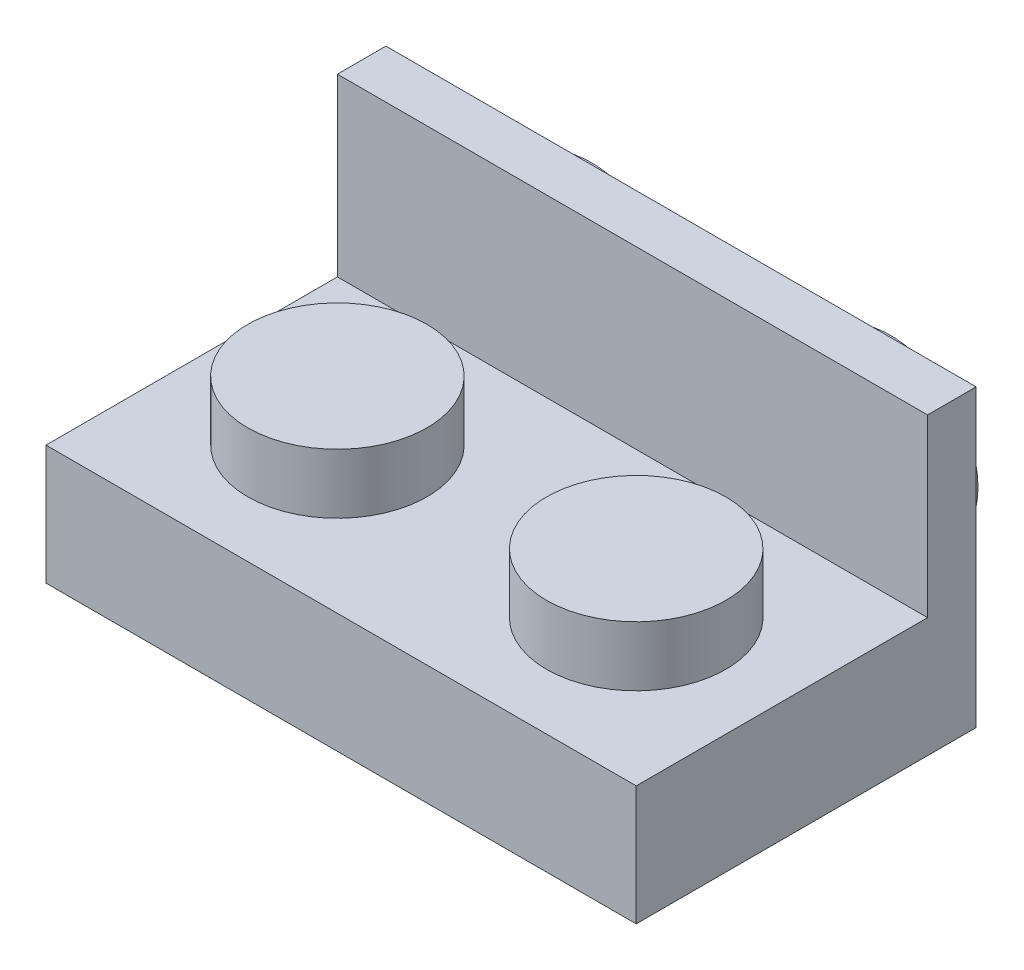
ISO-10303-21;
HEADER;
FILE_DESCRIPTION(('STEP AP214'),'2;1');
FILE_NAME('part.step','',(''),(''),'','','');
FILE_SCHEMA(('AUTOMOTIVE_DESIGN { 1 0 10303 214 1 1 1 1 }'));
ENDSEC;
DATA;
#1=APPLICATION_CONTEXT('core data for automotive mechanical design processes');
#2=APPLICATION_PROTOCOL_DEFINITION('international standard','automotive_design',2000,#1);
#3=PRODUCT_CONTEXT('',#1,'mechanical');
#4=PRODUCT('Part','Part','',(#3));
#5=PRODUCT_RELATED_PRODUCT_CATEGORY('part','',(#4));
#6=PRODUCT_DEFINITION_FORMATION('','',#4);
#7=PRODUCT_DEFINITION_CONTEXT('part definition',#1,'design');
#8=PRODUCT_DEFINITION('design','',#6,#7);
#9=PRODUCT_DEFINITION_SHAPE('','',#8);
#10=(LENGTH_UNIT() NAMED_UNIT(*) SI_UNIT(.MILLI.,.METRE.));
#11=(NAMED_UNIT(*) PLANE_ANGLE_UNIT() SI_UNIT($,.RADIAN.));
#12=(NAMED_UNIT(*) SI_UNIT($,.STERADIAN.) SOLID_ANGLE_UNIT());
#13=UNCERTAINTY_MEASURE_WITH_UNIT(LENGTH_MEASURE(1.E-05),#10,'distance_accuracy_value','');
#14=(GEOMETRIC_REPRESENTATION_CONTEXT(3) GLOBAL_UNCERTAINTY_ASSIGNED_CONTEXT((#13)) GLOBAL_UNIT_ASSIGNED_CONTEXT((#10,
#11,#12)) REPRESENTATION_CONTEXT('',''));
#15=CARTESIAN_POINT('',(0.,0.,0.));
#16=DIRECTION('',(0.,0.,1.));
#17=DIRECTION('',(1.,0.,0.));
#18=AXIS2_PLACEMENT_3D('',#15,#16,#17);
#19=CARTESIAN_POINT('',(0.,0.,-7.8));
#20=DIRECTION('',(0.,-1.,0.));
#21=DIRECTION('',(0.,0.,-1.));
#22=AXIS2_PLACEMENT_3D('',#19,#20,#21);
#23=PLANE('',#22);
#24=DIRECTION('',(1.,0.,0.));
#25=VECTOR('',#24,1.);
#26=CARTESIAN_POINT('',(0.,0.,0.));
#27=LINE('',#26,#25);
#28=CARTESIAN_POINT('',(0.,0.,0.));
#29=VERTEX_POINT('',#28);
#30=CARTESIAN_POINT('',(15.8,0.,0.));
#31=VERTEX_POINT('',#30);
#32=EDGE_CURVE('E107',#29,#31,#27,.T.);
#33=ORIENTED_EDGE('',*,*,#32,.F.);
#34=DIRECTION('',(0.,0.,1.));
#35=VECTOR('',#34,1.);
#36=CARTESIAN_POINT('',(0.,0.,-7.8));
#37=LINE('',#36,#35);
#38=CARTESIAN_POINT('',(0.,0.,-9.1));
#39=VERTEX_POINT('',#38);
#40=EDGE_CURVE('E113',#39,#29,#37,.T.);
#41=ORIENTED_EDGE('',*,*,#40,.F.);
#42=DIRECTION('',(-1.,0.,0.));
#43=VECTOR('',#42,1.);
#44=CARTESIAN_POINT('',(0.,0.,-9.1));
#45=LINE('',#44,#43);
#46=CARTESIAN_POINT('',(15.8,0.,-9.1));
#47=VERTEX_POINT('',#46);
#48=EDGE_CURVE('E141',#47,#39,#45,.T.);
#49=ORIENTED_EDGE('',*,*,#48,.F.);
#50=DIRECTION('',(0.,0.,1.));
#51=VECTOR('',#50,1.);
#52=CARTESIAN_POINT('',(15.8,0.,-7.8));
#53=LINE('',#52,#51);
#54=EDGE_CURVE('E99',#47,#31,#53,.T.);
#55=ORIENTED_EDGE('',*,*,#54,.T.);
#56=EDGE_LOOP('',(#33,#41,#49,#55));
#57=FACE_BOUND('',#56,.T.);
#58=DIRECTION('',(0.,0.,1.));
#59=VECTOR('',#58,1.);
#60=CARTESIAN_POINT('',(1.2,0.,-7.8));
#61=LINE('',#60,#59);
#62=CARTESIAN_POINT('',(1.2,0.,-6.6));
#63=VERTEX_POINT('',#62);
#64=CARTESIAN_POINT('',(1.2,0.,-1.2));
#65=VERTEX_POINT('',#64);
#66=EDGE_CURVE('E211',#63,#65,#61,.T.);
#67=ORIENTED_EDGE('',*,*,#66,.T.);
#68=DIRECTION('',(1.,0.,0.));
#69=VECTOR('',#68,1.);
#70=CARTESIAN_POINT('',(0.,0.,-1.2));
#71=LINE('',#70,#69);
#72=CARTESIAN_POINT('',(14.6,0.,-1.2));
#73=VERTEX_POINT('',#72);
#74=EDGE_CURVE('E186',#65,#73,#71,.T.);
#75=ORIENTED_EDGE('',*,*,#74,.T.);
#76=DIRECTION('',(0.,0.,1.));
#77=VECTOR('',#76,1.);
#78=CARTESIAN_POINT('',(14.6,0.,-7.8));
#79=LINE('',#78,#77);
#80=CARTESIAN_POINT('',(14.6,0.,-6.6));
#81=VERTEX_POINT('',#80);
#82=EDGE_CURVE('E207',#81,#73,#79,.T.);
#83=ORIENTED_EDGE('',*,*,#82,.F.);
#84=DIRECTION('',(1.,0.,0.));
#85=VECTOR('',#84,1.);
#86=CARTESIAN_POINT('',(0.,0.,-6.6));
#87=LINE('',#86,#85);
#88=EDGE_CURVE('E56',#63,#81,#87,.T.);
#89=ORIENTED_EDGE('',*,*,#88,.F.);
#90=EDGE_LOOP('',(#67,#75,#83,#89));
#91=FACE_BOUND('',#90,.T.);
#92=ADVANCED_FACE('F41',(#57,#91),#23,.T.);
#93=CARTESIAN_POINT('',(0.,0.,-7.8));
#94=DIRECTION('',(-1.,0.,0.));
#95=DIRECTION('',(0.,0.,1.));
#96=AXIS2_PLACEMENT_3D('',#93,#94,#95);
#97=PLANE('',#96);
#98=DIRECTION('',(0.,-1.,0.));
#99=VECTOR('',#98,1.);
#100=CARTESIAN_POINT('',(0.,0.,0.));
#101=LINE('',#100,#99);
#102=CARTESIAN_POINT('',(0.,3.2,0.));
#103=VERTEX_POINT('',#102);
#104=EDGE_CURVE('E236',#103,#29,#101,.T.);
#105=ORIENTED_EDGE('',*,*,#104,.F.);
#106=DIRECTION('',(0.,0.,1.));
#107=VECTOR('',#106,1.);
#108=CARTESIAN_POINT('',(0.,3.2,-7.8));
#109=LINE('',#108,#107);
#110=CARTESIAN_POINT('',(0.,3.2,-7.8));
#111=VERTEX_POINT('',#110);
#112=EDGE_CURVE('E98',#111,#103,#109,.T.);
#113=ORIENTED_EDGE('',*,*,#112,.F.);
#114=DIRECTION('',(0.,1.,0.));
#115=VECTOR('',#114,1.);
#116=CARTESIAN_POINT('',(0.,7.9,-7.8));
#117=LINE('',#116,#115);
#118=CARTESIAN_POINT('',(0.,7.9,-7.8));
#119=VERTEX_POINT('',#118);
#120=EDGE_CURVE('E65',#111,#119,#117,.T.);
#121=ORIENTED_EDGE('',*,*,#120,.T.);
#122=DIRECTION('',(0.,0.,1.));
#123=VECTOR('',#122,1.);
#124=CARTESIAN_POINT('',(0.,7.9,-9.1));
#125=LINE('',#124,#123);
#126=CARTESIAN_POINT('',(0.,7.9,-9.1));
#127=VERTEX_POINT('',#126);
#128=EDGE_CURVE('E170',#127,#119,#125,.T.);
#129=ORIENTED_EDGE('',*,*,#128,.F.);
#130=DIRECTION('',(0.,1.,0.));
#131=VECTOR('',#130,1.);
#132=CARTESIAN_POINT('',(0.,7.9,-9.1));
#133=LINE('',#132,#131);
#134=EDGE_CURVE('E145',#39,#127,#133,.T.);
#135=ORIENTED_EDGE('',*,*,#134,.F.);
#136=ORIENTED_EDGE('',*,*,#40,.T.);
#137=EDGE_LOOP('',(#105,#113,#121,#129,#135,#136));
#138=FACE_BOUND('',#137,.T.);
#139=ADVANCED_FACE('F43',(#138),#97,.T.);
#140=CARTESIAN_POINT('',(0.,3.2,-7.8));
#141=DIRECTION('',(0.,1.,0.));
#142=DIRECTION('',(0.,0.,1.));
#143=AXIS2_PLACEMENT_3D('',#140,#141,#142);
#144=PLANE('',#143);
#145=CARTESIAN_POINT('',(11.9,3.2,-3.9));
#146=DIRECTION('',(0.,1.,0.));
#147=DIRECTION('',(0.,0.,1.));
#148=AXIS2_PLACEMENT_3D('',#145,#146,#147);
#149=CIRCLE('',#148,2.4);
#150=CARTESIAN_POINT('',(11.9,3.2,-1.5));
#151=VERTEX_POINT('',#150);
#152=EDGE_CURVE('E191',#151,#151,#149,.T.);
#153=ORIENTED_EDGE('',*,*,#152,.F.);
#154=EDGE_LOOP('',(#153));
#155=FACE_BOUND('',#154,.T.);
#156=CARTESIAN_POINT('',(3.9,3.2,-3.9));
#157=DIRECTION('',(0.,1.,0.));
#158=DIRECTION('',(0.,0.,1.));
#159=AXIS2_PLACEMENT_3D('',#156,#157,#158);
#160=CIRCLE('',#159,2.4);
#161=CARTESIAN_POINT('',(3.9,3.2,-1.5));
#162=VERTEX_POINT('',#161);
#163=EDGE_CURVE('E232',#162,#162,#160,.T.);
#164=ORIENTED_EDGE('',*,*,#163,.F.);
#165=EDGE_LOOP('',(#164));
#166=FACE_BOUND('',#165,.T.);
#167=DIRECTION('',(-1.,0.,0.));
#168=VECTOR('',#167,1.);
#169=CARTESIAN_POINT('',(0.,3.2,0.));
#170=LINE('',#169,#168);
#171=CARTESIAN_POINT('',(15.8,3.2,0.));
#172=VERTEX_POINT('',#171);
#173=EDGE_CURVE('E105',#172,#103,#170,.T.);
#174=ORIENTED_EDGE('',*,*,#173,.F.);
#175=DIRECTION('',(0.,0.,1.));
#176=VECTOR('',#175,1.);
#177=CARTESIAN_POINT('',(15.8,3.2,-7.8));
#178=LINE('',#177,#176);
#179=CARTESIAN_POINT('',(15.8,3.2,-7.8));
#180=VERTEX_POINT('',#179);
#181=EDGE_CURVE('E85',#180,#172,#178,.T.);
#182=ORIENTED_EDGE('',*,*,#181,.F.);
#183=DIRECTION('',(-1.,0.,0.));
#184=VECTOR('',#183,1.);
#185=CARTESIAN_POINT('',(0.,3.2,-7.8));
#186=LINE('',#185,#184);
#187=EDGE_CURVE('E111',#180,#111,#186,.T.);
#188=ORIENTED_EDGE('',*,*,#187,.T.);
#189=ORIENTED_EDGE('',*,*,#112,.T.);
#190=EDGE_LOOP('',(#174,#182,#188,#189));
#191=FACE_BOUND('',#190,.T.);
#192=ADVANCED_FACE('F109',(#155,#166,#191),#144,.T.);
#193=CARTESIAN_POINT('',(15.8,0.,-7.8));
#194=DIRECTION('',(1.,0.,0.));
#195=DIRECTION('',(0.,0.,-1.));
#196=AXIS2_PLACEMENT_3D('',#193,#194,#195);
#197=PLANE('',#196);
#198=DIRECTION('',(0.,1.,0.));
#199=VECTOR('',#198,1.);
#200=CARTESIAN_POINT('',(15.8,0.,0.));
#201=LINE('',#200,#199);
#202=EDGE_CURVE('E89',#31,#172,#201,.T.);
#203=ORIENTED_EDGE('',*,*,#202,.F.);
#204=ORIENTED_EDGE('',*,*,#54,.F.);
#205=DIRECTION('',(0.,-1.,0.));
#206=VECTOR('',#205,1.);
#207=CARTESIAN_POINT('',(15.8,0.,-9.1));
#208=LINE('',#207,#206);
#209=CARTESIAN_POINT('',(15.8,7.9,-9.1));
#210=VERTEX_POINT('',#209);
#211=EDGE_CURVE('E149',#210,#47,#208,.T.);
#212=ORIENTED_EDGE('',*,*,#211,.F.);
#213=DIRECTION('',(0.,0.,1.));
#214=VECTOR('',#213,1.);
#215=CARTESIAN_POINT('',(15.8,7.9,-9.1));
#216=LINE('',#215,#214);
#217=CARTESIAN_POINT('',(15.8,7.9,-7.8));
#218=VERTEX_POINT('',#217);
#219=EDGE_CURVE('E165',#210,#218,#216,.T.);
#220=ORIENTED_EDGE('',*,*,#219,.T.);
#221=DIRECTION('',(0.,-1.,0.));
#222=VECTOR('',#221,1.);
#223=CARTESIAN_POINT('',(15.8,0.,-7.8));
#224=LINE('',#223,#222);
#225=EDGE_CURVE('E94',#218,#180,#224,.T.);
#226=ORIENTED_EDGE('',*,*,#225,.T.);
#227=ORIENTED_EDGE('',*,*,#181,.T.);
#228=EDGE_LOOP('',(#203,#204,#212,#220,#226,#227));
#229=FACE_BOUND('',#228,.T.);
#230=ADVANCED_FACE('F87',(#229),#197,.T.);
#231=CARTESIAN_POINT('',(0.,0.,0.));
#232=DIRECTION('',(0.,0.,-1.));
#233=DIRECTION('',(-1.,0.,0.));
#234=AXIS2_PLACEMENT_3D('',#231,#232,#233);
#235=PLANE('',#234);
#236=ORIENTED_EDGE('',*,*,#104,.T.);
#237=ORIENTED_EDGE('',*,*,#32,.T.);
#238=ORIENTED_EDGE('',*,*,#202,.T.);
#239=ORIENTED_EDGE('',*,*,#173,.T.);
#240=EDGE_LOOP('',(#236,#237,#238,#239));
#241=FACE_BOUND('',#240,.T.);
#242=ADVANCED_FACE('F104',(#241),#235,.F.);
#243=CARTESIAN_POINT('',(3.9,4.8,-3.9));
#244=DIRECTION('',(0.,-1.,0.));
#245=DIRECTION('',(0.,0.,-1.));
#246=AXIS2_PLACEMENT_3D('',#243,#244,#245);
#247=CYLINDRICAL_SURFACE('',#246,2.4);
#248=CARTESIAN_POINT('',(3.9,4.8,-3.9));
#249=DIRECTION('',(0.,1.,0.));
#250=DIRECTION('',(0.,0.,1.));
#251=AXIS2_PLACEMENT_3D('',#248,#249,#250);
#252=CIRCLE('',#251,2.4);
#253=CARTESIAN_POINT('',(3.9,4.8,-1.5));
#254=VERTEX_POINT('',#253);
#255=EDGE_CURVE('E233',#254,#254,#252,.T.);
#256=ORIENTED_EDGE('',*,*,#255,.F.);
#257=EDGE_LOOP('',(#256));
#258=FACE_BOUND('',#257,.T.);
#259=ORIENTED_EDGE('',*,*,#163,.T.);
#260=EDGE_LOOP('',(#259));
#261=FACE_BOUND('',#260,.T.);
#262=ADVANCED_FACE('F286',(#258,#261),#247,.T.);
#263=CARTESIAN_POINT('',(3.9,4.8,-3.9));
#264=DIRECTION('',(0.,1.,0.));
#265=DIRECTION('',(0.,0.,1.));
#266=AXIS2_PLACEMENT_3D('',#263,#264,#265);
#267=PLANE('',#266);
#268=ORIENTED_EDGE('',*,*,#255,.T.);
#269=EDGE_LOOP('',(#268));
#270=FACE_BOUND('',#269,.T.);
#271=ADVANCED_FACE('F289',(#270),#267,.T.);
#272=CARTESIAN_POINT('',(11.9,4.8,-3.9));
#273=DIRECTION('',(0.,-1.,0.));
#274=DIRECTION('',(0.,0.,-1.));
#275=AXIS2_PLACEMENT_3D('',#272,#273,#274);
#276=CYLINDRICAL_SURFACE('',#275,2.4);
#277=CARTESIAN_POINT('',(11.9,4.8,-3.9));
#278=DIRECTION('',(0.,1.,0.));
#279=DIRECTION('',(0.,0.,1.));
#280=AXIS2_PLACEMENT_3D('',#277,#278,#279);
#281=CIRCLE('',#280,2.4);
#282=CARTESIAN_POINT('',(11.9,4.8,-1.5));
#283=VERTEX_POINT('',#282);
#284=EDGE_CURVE('E229',#283,#283,#281,.T.);
#285=ORIENTED_EDGE('',*,*,#284,.F.);
#286=EDGE_LOOP('',(#285));
#287=FACE_BOUND('',#286,.T.);
#288=ORIENTED_EDGE('',*,*,#152,.T.);
#289=EDGE_LOOP('',(#288));
#290=FACE_BOUND('',#289,.T.);
#291=ADVANCED_FACE('F293',(#287,#290),#276,.T.);
#292=CARTESIAN_POINT('',(11.9,4.8,-3.9));
#293=DIRECTION('',(0.,1.,0.));
#294=DIRECTION('',(0.,0.,1.));
#295=AXIS2_PLACEMENT_3D('',#292,#293,#294);
#296=PLANE('',#295);
#297=ORIENTED_EDGE('',*,*,#284,.T.);
#298=EDGE_LOOP('',(#297));
#299=FACE_BOUND('',#298,.T.);
#300=ADVANCED_FACE('F297',(#299),#296,.T.);
#301=CARTESIAN_POINT('',(1.2,0.,-7.8));
#302=DIRECTION('',(-1.,0.,0.));
#303=DIRECTION('',(0.,0.,1.));
#304=AXIS2_PLACEMENT_3D('',#301,#302,#303);
#305=PLANE('',#304);
#306=DIRECTION('',(0.,-1.,0.));
#307=VECTOR('',#306,1.);
#308=CARTESIAN_POINT('',(1.2,0.,-1.2));
#309=LINE('',#308,#307);
#310=CARTESIAN_POINT('',(1.2,2.,-1.2));
#311=VERTEX_POINT('',#310);
#312=EDGE_CURVE('E183',#311,#65,#309,.T.);
#313=ORIENTED_EDGE('',*,*,#312,.T.);
#314=ORIENTED_EDGE('',*,*,#66,.F.);
#315=DIRECTION('',(0.,-1.,0.));
#316=VECTOR('',#315,1.);
#317=CARTESIAN_POINT('',(1.2,0.,-6.6));
#318=LINE('',#317,#316);
#319=CARTESIAN_POINT('',(1.2,2.,-6.6));
#320=VERTEX_POINT('',#319);
#321=EDGE_CURVE('E193',#320,#63,#318,.T.);
#322=ORIENTED_EDGE('',*,*,#321,.F.);
#323=DIRECTION('',(0.,0.,1.));
#324=VECTOR('',#323,1.);
#325=CARTESIAN_POINT('',(1.2,2.,-7.8));
#326=LINE('',#325,#324);
#327=EDGE_CURVE('E188',#320,#311,#326,.T.);
#328=ORIENTED_EDGE('',*,*,#327,.T.);
#329=EDGE_LOOP('',(#313,#314,#322,#328));
#330=FACE_BOUND('',#329,.T.);
#331=ADVANCED_FACE('F271',(#330),#305,.F.);
#332=CARTESIAN_POINT('',(0.,2.,-7.8));
#333=DIRECTION('',(0.,1.,0.));
#334=DIRECTION('',(0.,0.,1.));
#335=AXIS2_PLACEMENT_3D('',#332,#333,#334);
#336=PLANE('',#335);
#337=CARTESIAN_POINT('',(7.9,2.,-3.9));
#338=DIRECTION('',(0.,1.,0.));
#339=DIRECTION('',(0.,0.,1.));
#340=AXIS2_PLACEMENT_3D('',#337,#338,#339);
#341=CIRCLE('',#340,1.5);
#342=CARTESIAN_POINT('',(7.9,2.,-2.4));
#343=VERTEX_POINT('',#342);
#344=EDGE_CURVE('E117',#343,#343,#341,.F.);
#345=ORIENTED_EDGE('',*,*,#344,.F.);
#346=EDGE_LOOP('',(#345));
#347=FACE_BOUND('',#346,.T.);
#348=CARTESIAN_POINT('',(11.9,2.,-3.9));
#349=DIRECTION('',(0.,1.,0.));
#350=DIRECTION('',(0.,0.,1.));
#351=AXIS2_PLACEMENT_3D('',#348,#349,#350);
#352=CIRCLE('',#351,1.2);
#353=CARTESIAN_POINT('',(11.9,2.,-2.7));
#354=VERTEX_POINT('',#353);
#355=EDGE_CURVE('E177',#354,#354,#352,.T.);
#356=ORIENTED_EDGE('',*,*,#355,.T.);
#357=EDGE_LOOP('',(#356));
#358=FACE_BOUND('',#357,.T.);
#359=CARTESIAN_POINT('',(3.9,2.,-3.9));
#360=DIRECTION('',(0.,1.,0.));
#361=DIRECTION('',(0.,0.,1.));
#362=AXIS2_PLACEMENT_3D('',#359,#360,#361);
#363=CIRCLE('',#362,1.2);
#364=CARTESIAN_POINT('',(3.9,2.,-2.7));
#365=VERTEX_POINT('',#364);
#366=EDGE_CURVE('E199',#365,#365,#363,.T.);
#367=ORIENTED_EDGE('',*,*,#366,.T.);
#368=EDGE_LOOP('',(#367));
#369=FACE_BOUND('',#368,.T.);
#370=DIRECTION('',(-1.,0.,0.));
#371=VECTOR('',#370,1.);
#372=CARTESIAN_POINT('',(0.,2.,-1.2));
#373=LINE('',#372,#371);
#374=CARTESIAN_POINT('',(14.6,2.,-1.2));
#375=VERTEX_POINT('',#374);
#376=EDGE_CURVE('E195',#375,#311,#373,.T.);
#377=ORIENTED_EDGE('',*,*,#376,.T.);
#378=ORIENTED_EDGE('',*,*,#327,.F.);
#379=DIRECTION('',(-1.,0.,0.));
#380=VECTOR('',#379,1.);
#381=CARTESIAN_POINT('',(0.,2.,-6.6));
#382=LINE('',#381,#380);
#383=CARTESIAN_POINT('',(14.6,2.,-6.6));
#384=VERTEX_POINT('',#383);
#385=EDGE_CURVE('E208',#384,#320,#382,.T.);
#386=ORIENTED_EDGE('',*,*,#385,.F.);
#387=DIRECTION('',(0.,0.,1.));
#388=VECTOR('',#387,1.);
#389=CARTESIAN_POINT('',(14.6,2.,-7.8));
#390=LINE('',#389,#388);
#391=EDGE_CURVE('E192',#384,#375,#390,.T.);
#392=ORIENTED_EDGE('',*,*,#391,.T.);
#393=EDGE_LOOP('',(#377,#378,#386,#392));
#394=FACE_BOUND('',#393,.T.);
#395=ADVANCED_FACE('F327',(#347,#358,#369,#394),#336,.F.);
#396=CARTESIAN_POINT('',(14.6,0.,-7.8));
#397=DIRECTION('',(1.,0.,0.));
#398=DIRECTION('',(0.,0.,-1.));
#399=AXIS2_PLACEMENT_3D('',#396,#397,#398);
#400=PLANE('',#399);
#401=DIRECTION('',(0.,1.,0.));
#402=VECTOR('',#401,1.);
#403=CARTESIAN_POINT('',(14.6,0.,-1.2));
#404=LINE('',#403,#402);
#405=EDGE_CURVE('E204',#73,#375,#404,.T.);
#406=ORIENTED_EDGE('',*,*,#405,.T.);
#407=ORIENTED_EDGE('',*,*,#391,.F.);
#408=DIRECTION('',(0.,1.,0.));
#409=VECTOR('',#408,1.);
#410=CARTESIAN_POINT('',(14.6,0.,-6.6));
#411=LINE('',#410,#409);
#412=EDGE_CURVE('E212',#81,#384,#411,.T.);
#413=ORIENTED_EDGE('',*,*,#412,.F.);
#414=ORIENTED_EDGE('',*,*,#82,.T.);
#415=EDGE_LOOP('',(#406,#407,#413,#414));
#416=FACE_BOUND('',#415,.T.);
#417=ADVANCED_FACE('F324',(#416),#400,.F.);
#418=CARTESIAN_POINT('',(0.,0.,-6.6));
#419=DIRECTION('',(0.,0.,-1.));
#420=DIRECTION('',(-1.,0.,0.));
#421=AXIS2_PLACEMENT_3D('',#418,#419,#420);
#422=PLANE('',#421);
#423=ORIENTED_EDGE('',*,*,#321,.T.);
#424=ORIENTED_EDGE('',*,*,#88,.T.);
#425=ORIENTED_EDGE('',*,*,#412,.T.);
#426=ORIENTED_EDGE('',*,*,#385,.T.);
#427=EDGE_LOOP('',(#423,#424,#425,#426));
#428=FACE_BOUND('',#427,.T.);
#429=ADVANCED_FACE('F321',(#428),#422,.F.);
#430=CARTESIAN_POINT('',(0.,0.,-1.2));
#431=DIRECTION('',(0.,0.,-1.));
#432=DIRECTION('',(-1.,0.,0.));
#433=AXIS2_PLACEMENT_3D('',#430,#431,#432);
#434=PLANE('',#433);
#435=ORIENTED_EDGE('',*,*,#312,.F.);
#436=ORIENTED_EDGE('',*,*,#376,.F.);
#437=ORIENTED_EDGE('',*,*,#405,.F.);
#438=ORIENTED_EDGE('',*,*,#74,.F.);
#439=EDGE_LOOP('',(#435,#436,#437,#438));
#440=FACE_BOUND('',#439,.T.);
#441=ADVANCED_FACE('F268',(#440),#434,.T.);
#442=CARTESIAN_POINT('',(3.9,4.8,-3.9));
#443=DIRECTION('',(0.,-1.,0.));
#444=DIRECTION('',(0.,0.,-1.));
#445=AXIS2_PLACEMENT_3D('',#442,#443,#444);
#446=CYLINDRICAL_SURFACE('',#445,1.2);
#447=CARTESIAN_POINT('',(3.9,3.6,-3.9));
#448=DIRECTION('',(0.,1.,0.));
#449=DIRECTION('',(0.,0.,1.));
#450=AXIS2_PLACEMENT_3D('',#447,#448,#449);
#451=CIRCLE('',#450,1.2);
#452=CARTESIAN_POINT('',(3.9,3.6,-2.7));
#453=VERTEX_POINT('',#452);
#454=EDGE_CURVE('E187',#453,#453,#451,.T.);
#455=ORIENTED_EDGE('',*,*,#454,.T.);
#456=EDGE_LOOP('',(#455));
#457=FACE_BOUND('',#456,.T.);
#458=ORIENTED_EDGE('',*,*,#366,.F.);
#459=EDGE_LOOP('',(#458));
#460=FACE_BOUND('',#459,.T.);
#461=ADVANCED_FACE('F314',(#457,#460),#446,.F.);
#462=CARTESIAN_POINT('',(3.9,3.6,-3.9));
#463=DIRECTION('',(0.,1.,0.));
#464=DIRECTION('',(0.,0.,1.));
#465=AXIS2_PLACEMENT_3D('',#462,#463,#464);
#466=PLANE('',#465);
#467=ORIENTED_EDGE('',*,*,#454,.F.);
#468=EDGE_LOOP('',(#467));
#469=FACE_BOUND('',#468,.T.);
#470=ADVANCED_FACE('F310',(#469),#466,.F.);
#471=CARTESIAN_POINT('',(11.9,4.8,-3.9));
#472=DIRECTION('',(0.,-1.,0.));
#473=DIRECTION('',(0.,0.,-1.));
#474=AXIS2_PLACEMENT_3D('',#471,#472,#473);
#475=CYLINDRICAL_SURFACE('',#474,1.2);
#476=CARTESIAN_POINT('',(11.9,3.6,-3.9));
#477=DIRECTION('',(0.,1.,0.));
#478=DIRECTION('',(0.,0.,1.));
#479=AXIS2_PLACEMENT_3D('',#476,#477,#478);
#480=CIRCLE('',#479,1.2);
#481=CARTESIAN_POINT('',(11.9,3.6,-2.7));
#482=VERTEX_POINT('',#481);
#483=EDGE_CURVE('E198',#482,#482,#480,.T.);
#484=ORIENTED_EDGE('',*,*,#483,.T.);
#485=EDGE_LOOP('',(#484));
#486=FACE_BOUND('',#485,.T.);
#487=ORIENTED_EDGE('',*,*,#355,.F.);
#488=EDGE_LOOP('',(#487));
#489=FACE_BOUND('',#488,.T.);
#490=ADVANCED_FACE('F306',(#486,#489),#475,.F.);
#491=CARTESIAN_POINT('',(11.9,3.6,-3.9));
#492=DIRECTION('',(0.,1.,0.));
#493=DIRECTION('',(0.,0.,1.));
#494=AXIS2_PLACEMENT_3D('',#491,#492,#493);
#495=PLANE('',#494);
#496=ORIENTED_EDGE('',*,*,#483,.F.);
#497=EDGE_LOOP('',(#496));
#498=FACE_BOUND('',#497,.T.);
#499=ADVANCED_FACE('F302',(#498),#495,.F.);
#500=CARTESIAN_POINT('',(7.9,-4.24264068711929,-3.9));
#501=DIRECTION('',(0.,1.,0.));
#502=DIRECTION('',(0.,0.,1.));
#503=AXIS2_PLACEMENT_3D('',#500,#501,#502);
#504=CYLINDRICAL_SURFACE('',#503,1.5);
#505=ORIENTED_EDGE('',*,*,#344,.T.);
#506=EDGE_LOOP('',(#505));
#507=FACE_BOUND('',#506,.T.);
#508=CARTESIAN_POINT('',(7.9,0.2,-3.9));
#509=DIRECTION('',(0.,-1.,0.));
#510=DIRECTION('',(0.,0.,-1.));
#511=AXIS2_PLACEMENT_3D('',#508,#509,#510);
#512=CIRCLE('',#511,1.5);
#513=CARTESIAN_POINT('',(7.9,0.2,-5.4));
#514=VERTEX_POINT('',#513);
#515=EDGE_CURVE('E174',#514,#514,#512,.T.);
#516=ORIENTED_EDGE('',*,*,#515,.F.);
#517=EDGE_LOOP('',(#516));
#518=FACE_BOUND('',#517,.T.);
#519=ADVANCED_FACE('F305',(#507,#518),#504,.T.);
#520=CARTESIAN_POINT('',(7.9,-4.24264068711929,-3.9));
#521=DIRECTION('',(0.,1.,0.));
#522=DIRECTION('',(0.,0.,1.));
#523=AXIS2_PLACEMENT_3D('',#520,#521,#522);
#524=CYLINDRICAL_SURFACE('',#523,0.6);
#525=CARTESIAN_POINT('',(7.9,2.,-3.9));
#526=DIRECTION('',(0.,-1.,0.));
#527=DIRECTION('',(0.,0.,-1.));
#528=AXIS2_PLACEMENT_3D('',#525,#526,#527);
#529=CIRCLE('',#528,0.6);
#530=CARTESIAN_POINT('',(7.9,2.,-4.5));
#531=VERTEX_POINT('',#530);
#532=EDGE_CURVE('E178',#531,#531,#529,.T.);
#533=ORIENTED_EDGE('',*,*,#532,.F.);
#534=EDGE_LOOP('',(#533));
#535=FACE_BOUND('',#534,.T.);
#536=CARTESIAN_POINT('',(7.9,0.2,-3.9));
#537=DIRECTION('',(0.,-1.,0.));
#538=DIRECTION('',(0.,0.,-1.));
#539=AXIS2_PLACEMENT_3D('',#536,#537,#538);
#540=CIRCLE('',#539,0.6);
#541=CARTESIAN_POINT('',(7.9,0.2,-4.5));
#542=VERTEX_POINT('',#541);
#543=EDGE_CURVE('E173',#542,#542,#540,.T.);
#544=ORIENTED_EDGE('',*,*,#543,.T.);
#545=EDGE_LOOP('',(#544));
#546=FACE_BOUND('',#545,.T.);
#547=ADVANCED_FACE('F336',(#535,#546),#524,.F.);
#548=CARTESIAN_POINT('',(0.,0.2,-7.8));
#549=DIRECTION('',(0.,-1.,0.));
#550=DIRECTION('',(0.,0.,-1.));
#551=AXIS2_PLACEMENT_3D('',#548,#549,#550);
#552=PLANE('',#551);
#553=ORIENTED_EDGE('',*,*,#543,.F.);
#554=EDGE_LOOP('',(#553));
#555=FACE_BOUND('',#554,.T.);
#556=ORIENTED_EDGE('',*,*,#515,.T.);
#557=EDGE_LOOP('',(#556));
#558=FACE_BOUND('',#557,.T.);
#559=ADVANCED_FACE('F340',(#555,#558),#552,.T.);
#560=ORIENTED_EDGE('',*,*,#532,.T.);
#561=EDGE_LOOP('',(#560));
#562=FACE_BOUND('',#561,.T.);
#563=ADVANCED_FACE('F331',(#562),#336,.F.);
#564=CARTESIAN_POINT('',(0.,0.,-7.8));
#565=DIRECTION('',(0.,0.,1.));
#566=DIRECTION('',(1.,0.,0.));
#567=AXIS2_PLACEMENT_3D('',#564,#565,#566);
#568=PLANE('',#567);
#569=ORIENTED_EDGE('',*,*,#187,.F.);
#570=ORIENTED_EDGE('',*,*,#225,.F.);
#571=DIRECTION('',(1.,0.,0.));
#572=VECTOR('',#571,1.);
#573=CARTESIAN_POINT('',(15.8,7.9,-7.8));
#574=LINE('',#573,#572);
#575=EDGE_CURVE('E157',#119,#218,#574,.T.);
#576=ORIENTED_EDGE('',*,*,#575,.F.);
#577=ORIENTED_EDGE('',*,*,#120,.F.);
#578=EDGE_LOOP('',(#569,#570,#576,#577));
#579=FACE_BOUND('',#578,.T.);
#580=ADVANCED_FACE('F347',(#579),#568,.T.);
#581=CARTESIAN_POINT('',(15.8,7.9,-9.1));
#582=DIRECTION('',(0.,-1.,0.));
#583=DIRECTION('',(0.,0.,-1.));
#584=AXIS2_PLACEMENT_3D('',#581,#582,#583);
#585=PLANE('',#584);
#586=ORIENTED_EDGE('',*,*,#575,.T.);
#587=ORIENTED_EDGE('',*,*,#219,.F.);
#588=DIRECTION('',(1.,0.,0.));
#589=VECTOR('',#588,1.);
#590=CARTESIAN_POINT('',(15.8,7.9,-9.1));
#591=LINE('',#590,#589);
#592=EDGE_CURVE('E155',#127,#210,#591,.T.);
#593=ORIENTED_EDGE('',*,*,#592,.F.);
#594=ORIENTED_EDGE('',*,*,#128,.T.);
#595=EDGE_LOOP('',(#586,#587,#593,#594));
#596=FACE_BOUND('',#595,.T.);
#597=ADVANCED_FACE('F131',(#596),#585,.F.);
#598=CARTESIAN_POINT('',(0.,0.,-9.1));
#599=DIRECTION('',(0.,0.,1.));
#600=DIRECTION('',(1.,0.,0.));
#601=AXIS2_PLACEMENT_3D('',#598,#599,#600);
#602=PLANE('',#601);
#603=CARTESIAN_POINT('',(3.9,4.,-9.1));
#604=DIRECTION('',(0.,0.,1.));
#605=DIRECTION('',(1.,0.,0.));
#606=AXIS2_PLACEMENT_3D('',#603,#604,#605);
#607=CIRCLE('',#606,2.35);
#608=CARTESIAN_POINT('',(6.25,4.,-9.1));
#609=VERTEX_POINT('',#608);
#610=EDGE_CURVE('E12',#609,#609,#607,.F.);
#611=ORIENTED_EDGE('',*,*,#610,.F.);
#612=EDGE_LOOP('',(#611));
#613=FACE_BOUND('',#612,.T.);
#614=CARTESIAN_POINT('',(11.9,4.,-9.1));
#615=DIRECTION('',(0.,0.,1.));
#616=DIRECTION('',(1.,0.,0.));
#617=AXIS2_PLACEMENT_3D('',#614,#615,#616);
#618=CIRCLE('',#617,2.35);
#619=CARTESIAN_POINT('',(14.25,4.,-9.1));
#620=VERTEX_POINT('',#619);
#621=EDGE_CURVE('E49',#620,#620,#618,.F.);
#622=ORIENTED_EDGE('',*,*,#621,.F.);
#623=EDGE_LOOP('',(#622));
#624=FACE_BOUND('',#623,.T.);
#625=ORIENTED_EDGE('',*,*,#48,.T.);
#626=ORIENTED_EDGE('',*,*,#134,.T.);
#627=ORIENTED_EDGE('',*,*,#592,.T.);
#628=ORIENTED_EDGE('',*,*,#211,.T.);
#629=EDGE_LOOP('',(#625,#626,#627,#628));
#630=FACE_BOUND('',#629,.T.);
#631=ADVANCED_FACE('F127',(#613,#624,#630),#602,.F.);
#632=CARTESIAN_POINT('',(11.9,4.,-10.7));
#633=DIRECTION('',(0.,0.,-1.));
#634=DIRECTION('',(-1.,0.,0.));
#635=AXIS2_PLACEMENT_3D('',#632,#633,#634);
#636=PLANE('',#635);
#637=CARTESIAN_POINT('',(11.9,4.,-10.7));
#638=DIRECTION('',(0.,0.,-1.));
#639=DIRECTION('',(-1.,0.,0.));
#640=AXIS2_PLACEMENT_3D('',#637,#638,#639);
#641=CIRCLE('',#640,2.35);
#642=CARTESIAN_POINT('',(9.55,4.,-10.7));
#643=VERTEX_POINT('',#642);
#644=EDGE_CURVE('E160',#643,#643,#641,.T.);
#645=ORIENTED_EDGE('',*,*,#644,.T.);
#646=EDGE_LOOP('',(#645));
#647=FACE_BOUND('',#646,.T.);
#648=CARTESIAN_POINT('',(11.9,4.,-10.7));
#649=DIRECTION('',(0.,0.,-1.));
#650=DIRECTION('',(-1.,0.,0.));
#651=AXIS2_PLACEMENT_3D('',#648,#649,#650);
#652=CIRCLE('',#651,1.65);
#653=CARTESIAN_POINT('',(10.25,4.,-10.7));
#654=VERTEX_POINT('',#653);
#655=EDGE_CURVE('E390',#654,#654,#652,.T.);
#656=ORIENTED_EDGE('',*,*,#655,.F.);
#657=EDGE_LOOP('',(#656));
#658=FACE_BOUND('',#657,.T.);
#659=ADVANCED_FACE('F130',(#647,#658),#636,.T.);
#660=CARTESIAN_POINT('',(11.9,4.,-10.7));
#661=DIRECTION('',(0.,0.,1.));
#662=DIRECTION('',(1.,0.,0.));
#663=AXIS2_PLACEMENT_3D('',#660,#661,#662);
#664=CYLINDRICAL_SURFACE('',#663,2.35);
#665=ORIENTED_EDGE('',*,*,#644,.F.);
#666=EDGE_LOOP('',(#665));
#667=FACE_BOUND('',#666,.T.);
#668=ORIENTED_EDGE('',*,*,#621,.T.);
#669=EDGE_LOOP('',(#668));
#670=FACE_BOUND('',#669,.T.);
#671=ADVANCED_FACE('F125',(#667,#670),#664,.T.);
#672=CARTESIAN_POINT('',(11.9,4.,-10.7));
#673=DIRECTION('',(0.,0.,1.));
#674=DIRECTION('',(1.,0.,0.));
#675=AXIS2_PLACEMENT_3D('',#672,#673,#674);
#676=CYLINDRICAL_SURFACE('',#675,1.65);
#677=ORIENTED_EDGE('',*,*,#655,.T.);
#678=EDGE_LOOP('',(#677));
#679=FACE_BOUND('',#678,.T.);
#680=CARTESIAN_POINT('',(11.9,4.,-9.1));
#681=DIRECTION('',(0.,0.,-1.));
#682=DIRECTION('',(-1.,0.,0.));
#683=AXIS2_PLACEMENT_3D('',#680,#681,#682);
#684=CIRCLE('',#683,1.65);
#685=CARTESIAN_POINT('',(10.25,4.,-9.1));
#686=VERTEX_POINT('',#685);
#687=EDGE_CURVE('E389',#686,#686,#684,.T.);
#688=ORIENTED_EDGE('',*,*,#687,.F.);
#689=EDGE_LOOP('',(#688));
#690=FACE_BOUND('',#689,.T.);
#691=ADVANCED_FACE('F353',(#679,#690),#676,.F.);
#692=ORIENTED_EDGE('',*,*,#687,.T.);
#693=EDGE_LOOP('',(#692));
#694=FACE_BOUND('',#693,.T.);
#695=ADVANCED_FACE('F135',(#694),#602,.F.);
#696=CARTESIAN_POINT('',(3.9,4.,-10.7));
#697=DIRECTION('',(0.,0.,-1.));
#698=DIRECTION('',(-1.,0.,0.));
#699=AXIS2_PLACEMENT_3D('',#696,#697,#698);
#700=PLANE('',#699);
#701=CARTESIAN_POINT('',(3.9,4.,-10.7));
#702=DIRECTION('',(0.,0.,-1.));
#703=DIRECTION('',(-1.,0.,0.));
#704=AXIS2_PLACEMENT_3D('',#701,#702,#703);
#705=CIRCLE('',#704,2.35);
#706=CARTESIAN_POINT('',(1.55,4.,-10.7));
#707=VERTEX_POINT('',#706);
#708=EDGE_CURVE('E384',#707,#707,#705,.T.);
#709=ORIENTED_EDGE('',*,*,#708,.T.);
#710=EDGE_LOOP('',(#709));
#711=FACE_BOUND('',#710,.T.);
#712=CARTESIAN_POINT('',(3.9,4.,-10.7));
#713=DIRECTION('',(0.,0.,-1.));
#714=DIRECTION('',(-1.,0.,0.));
#715=AXIS2_PLACEMENT_3D('',#712,#713,#714);
#716=CIRCLE('',#715,1.65);
#717=CARTESIAN_POINT('',(2.25,4.,-10.7));
#718=VERTEX_POINT('',#717);
#719=EDGE_CURVE('E379',#718,#718,#716,.T.);
#720=ORIENTED_EDGE('',*,*,#719,.F.);
#721=EDGE_LOOP('',(#720));
#722=FACE_BOUND('',#721,.T.);
#723=ADVANCED_FACE('F365',(#711,#722),#700,.T.);
#724=CARTESIAN_POINT('',(3.9,4.,-10.7));
#725=DIRECTION('',(0.,0.,1.));
#726=DIRECTION('',(1.,0.,0.));
#727=AXIS2_PLACEMENT_3D('',#724,#725,#726);
#728=CYLINDRICAL_SURFACE('',#727,2.35);
#729=ORIENTED_EDGE('',*,*,#708,.F.);
#730=EDGE_LOOP('',(#729));
#731=FACE_BOUND('',#730,.T.);
#732=ORIENTED_EDGE('',*,*,#610,.T.);
#733=EDGE_LOOP('',(#732));
#734=FACE_BOUND('',#733,.T.);
#735=ADVANCED_FACE('F361',(#731,#734),#728,.T.);
#736=CARTESIAN_POINT('',(3.9,4.,-10.7));
#737=DIRECTION('',(0.,0.,1.));
#738=DIRECTION('',(1.,0.,0.));
#739=AXIS2_PLACEMENT_3D('',#736,#737,#738);
#740=CYLINDRICAL_SURFACE('',#739,1.65);
#741=ORIENTED_EDGE('',*,*,#719,.T.);
#742=EDGE_LOOP('',(#741));
#743=FACE_BOUND('',#742,.T.);
#744=CARTESIAN_POINT('',(3.9,4.,-9.1));
#745=DIRECTION('',(0.,0.,-1.));
#746=DIRECTION('',(-1.,0.,0.));
#747=AXIS2_PLACEMENT_3D('',#744,#745,#746);
#748=CIRCLE('',#747,1.65);
#749=CARTESIAN_POINT('',(2.25,4.,-9.1));
#750=VERTEX_POINT('',#749);
#751=EDGE_CURVE('E382',#750,#750,#748,.T.);
#752=ORIENTED_EDGE('',*,*,#751,.F.);
#753=EDGE_LOOP('',(#752));
#754=FACE_BOUND('',#753,.T.);
#755=ADVANCED_FACE('F364',(#743,#754),#740,.F.);
#756=ORIENTED_EDGE('',*,*,#751,.T.);
#757=EDGE_LOOP('',(#756));
#758=FACE_BOUND('',#757,.T.);
#759=ADVANCED_FACE('F134',(#758),#602,.F.);
#760=CLOSED_SHELL('',(#92,#139,#192,#230,#242,#262,#271,#291,#300,#331,#395,#417,#429,#441,#461,
#470,#490,#499,#519,#547,#559,#563,#580,#597,#631,#659,#671,#691,#695,#723,#735,#755,#759));
#761=MANIFOLD_SOLID_BREP('B2',#760);
#762=ADVANCED_BREP_SHAPE_REPRESENTATION('',(#18,#761),#14);
#763=SHAPE_DEFINITION_REPRESENTATION(#9,#762);
ENDSEC;
END-ISO-10303-21;
